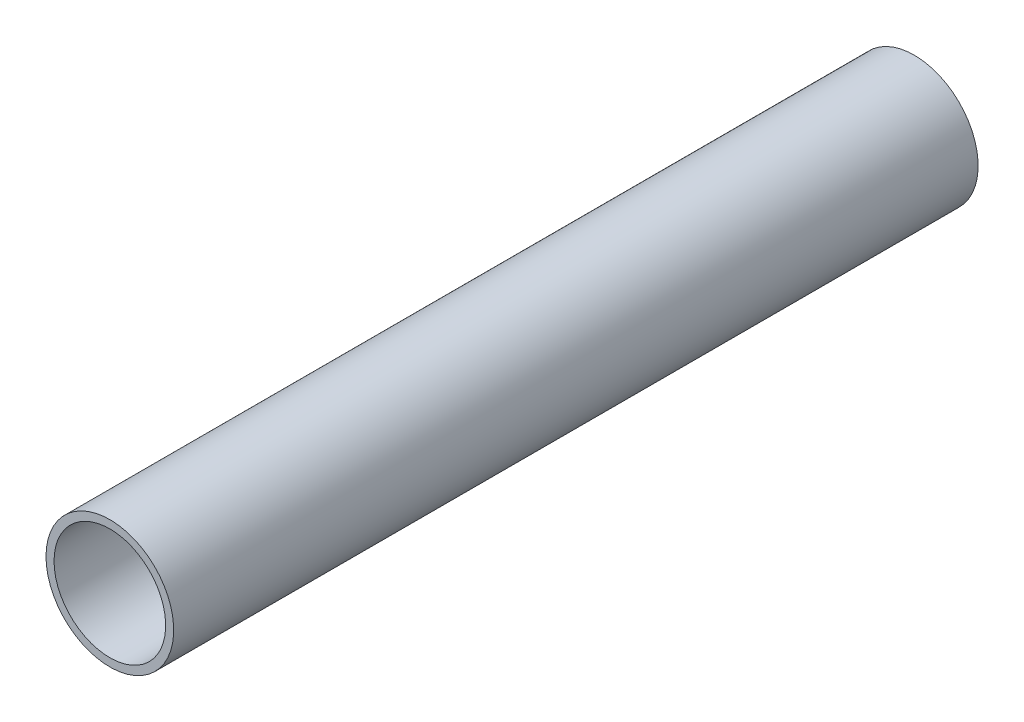
ISO-10303-21;
HEADER;
FILE_DESCRIPTION(('STEP AP214'),'2;1');
FILE_NAME('part.step','',(''),(''),'','','');
FILE_SCHEMA(('AUTOMOTIVE_DESIGN { 1 0 10303 214 1 1 1 1 }'));
ENDSEC;
DATA;
#1=APPLICATION_CONTEXT('core data for automotive mechanical design processes');
#2=APPLICATION_PROTOCOL_DEFINITION('international standard','automotive_design',2000,#1);
#3=PRODUCT_CONTEXT('',#1,'mechanical');
#4=PRODUCT('Part','Part','',(#3));
#5=PRODUCT_RELATED_PRODUCT_CATEGORY('part','',(#4));
#6=PRODUCT_DEFINITION_FORMATION('','',#4);
#7=PRODUCT_DEFINITION_CONTEXT('part definition',#1,'design');
#8=PRODUCT_DEFINITION('design','',#6,#7);
#9=PRODUCT_DEFINITION_SHAPE('','',#8);
#10=(LENGTH_UNIT() NAMED_UNIT(*) SI_UNIT(.MILLI.,.METRE.));
#11=(NAMED_UNIT(*) PLANE_ANGLE_UNIT() SI_UNIT($,.RADIAN.));
#12=(NAMED_UNIT(*) SI_UNIT($,.STERADIAN.) SOLID_ANGLE_UNIT());
#13=UNCERTAINTY_MEASURE_WITH_UNIT(LENGTH_MEASURE(1.E-05),#10,'distance_accuracy_value','');
#14=(GEOMETRIC_REPRESENTATION_CONTEXT(3) GLOBAL_UNCERTAINTY_ASSIGNED_CONTEXT((#13)) GLOBAL_UNIT_ASSIGNED_CONTEXT((#10,
#11,#12)) REPRESENTATION_CONTEXT('',''));
#15=CARTESIAN_POINT('',(0.,0.,0.));
#16=DIRECTION('',(0.,0.,1.));
#17=DIRECTION('',(1.,0.,0.));
#18=AXIS2_PLACEMENT_3D('',#15,#16,#17);
#19=CARTESIAN_POINT('',(0.,0.,50.));
#20=DIRECTION('',(0.,0.,1.));
#21=DIRECTION('',(1.,0.,0.));
#22=AXIS2_PLACEMENT_3D('',#19,#20,#21);
#23=PLANE('',#22);
#24=CARTESIAN_POINT('',(0.,0.,50.));
#25=DIRECTION('',(0.,0.,1.));
#26=DIRECTION('',(1.,0.,0.));
#27=AXIS2_PLACEMENT_3D('',#24,#25,#26);
#28=CIRCLE('',#27,7.9375);
#29=CARTESIAN_POINT('',(-7.9375,0.,50.));
#30=VERTEX_POINT('',#29);
#31=EDGE_CURVE('E10',#30,#30,#28,.T.);
#32=ORIENTED_EDGE('',*,*,#31,.T.);
#33=EDGE_LOOP('',(#32));
#34=FACE_BOUND('',#33,.T.);
#35=CARTESIAN_POINT('',(0.,0.,50.));
#36=DIRECTION('',(0.,0.,1.));
#37=DIRECTION('',(1.,0.,0.));
#38=AXIS2_PLACEMENT_3D('',#35,#36,#37);
#39=CIRCLE('',#38,6.9375);
#40=CARTESIAN_POINT('',(-6.9375,0.,50.));
#41=VERTEX_POINT('',#40);
#42=EDGE_CURVE('E42',#41,#41,#39,.T.);
#43=ORIENTED_EDGE('',*,*,#42,.F.);
#44=EDGE_LOOP('',(#43));
#45=FACE_BOUND('',#44,.T.);
#46=ADVANCED_FACE('F31',(#34,#45),#23,.T.);
#47=CARTESIAN_POINT('',(0.,0.,-50.));
#48=DIRECTION('',(0.,0.,1.));
#49=DIRECTION('',(1.,0.,0.));
#50=AXIS2_PLACEMENT_3D('',#47,#48,#49);
#51=PLANE('',#50);
#52=CARTESIAN_POINT('',(0.,0.,-50.));
#53=DIRECTION('',(0.,0.,1.));
#54=DIRECTION('',(1.,0.,0.));
#55=AXIS2_PLACEMENT_3D('',#52,#53,#54);
#56=CIRCLE('',#55,7.9375);
#57=CARTESIAN_POINT('',(-7.9375,0.,-50.));
#58=VERTEX_POINT('',#57);
#59=EDGE_CURVE('E35',#58,#58,#56,.T.);
#60=ORIENTED_EDGE('',*,*,#59,.F.);
#61=EDGE_LOOP('',(#60));
#62=FACE_BOUND('',#61,.T.);
#63=CARTESIAN_POINT('',(0.,0.,-50.));
#64=DIRECTION('',(0.,0.,1.));
#65=DIRECTION('',(1.,0.,0.));
#66=AXIS2_PLACEMENT_3D('',#63,#64,#65);
#67=CIRCLE('',#66,6.9375);
#68=CARTESIAN_POINT('',(-6.9375,0.,-50.));
#69=VERTEX_POINT('',#68);
#70=EDGE_CURVE('E44',#69,#69,#67,.T.);
#71=ORIENTED_EDGE('',*,*,#70,.T.);
#72=EDGE_LOOP('',(#71));
#73=FACE_BOUND('',#72,.T.);
#74=ADVANCED_FACE('F54',(#62,#73),#51,.F.);
#75=CARTESIAN_POINT('',(0.,0.,50.));
#76=DIRECTION('',(0.,0.,-1.));
#77=DIRECTION('',(-1.,0.,0.));
#78=AXIS2_PLACEMENT_3D('',#75,#76,#77);
#79=CYLINDRICAL_SURFACE('',#78,7.9375);
#80=CARTESIAN_POINT('',(-7.9375,0.,50.));
#81=CARTESIAN_POINT('',(-7.9375,0.,48.9583333333333));
#82=CARTESIAN_POINT('',(-7.9375,0.,47.9166666666667));
#83=CARTESIAN_POINT('',(-7.9375,0.,45.8333333333333));
#84=CARTESIAN_POINT('',(-7.9375,0.,44.7916666666667));
#85=CARTESIAN_POINT('',(-7.9375,0.,42.7083333333333));
#86=CARTESIAN_POINT('',(-7.9375,0.,41.6666666666667));
#87=CARTESIAN_POINT('',(-7.9375,0.,39.5833333333333));
#88=CARTESIAN_POINT('',(-7.9375,0.,38.5416666666667));
#89=CARTESIAN_POINT('',(-7.9375,0.,36.4583333333333));
#90=CARTESIAN_POINT('',(-7.9375,0.,35.4166666666667));
#91=CARTESIAN_POINT('',(-7.9375,0.,33.3333333333333));
#92=CARTESIAN_POINT('',(-7.9375,0.,32.2916666666667));
#93=CARTESIAN_POINT('',(-7.9375,0.,30.2083333333333));
#94=CARTESIAN_POINT('',(-7.9375,0.,29.1666666666667));
#95=CARTESIAN_POINT('',(-7.9375,0.,27.0833333333333));
#96=CARTESIAN_POINT('',(-7.9375,0.,26.0416666666667));
#97=CARTESIAN_POINT('',(-7.9375,0.,23.9583333333333));
#98=CARTESIAN_POINT('',(-7.9375,0.,22.9166666666667));
#99=CARTESIAN_POINT('',(-7.9375,0.,20.8333333333333));
#100=CARTESIAN_POINT('',(-7.9375,0.,19.7916666666667));
#101=CARTESIAN_POINT('',(-7.9375,0.,17.7083333333333));
#102=CARTESIAN_POINT('',(-7.9375,0.,16.6666666666667));
#103=CARTESIAN_POINT('',(-7.9375,0.,14.5833333333333));
#104=CARTESIAN_POINT('',(-7.9375,0.,13.5416666666667));
#105=CARTESIAN_POINT('',(-7.9375,0.,11.4583333333333));
#106=CARTESIAN_POINT('',(-7.9375,0.,10.4166666666667));
#107=CARTESIAN_POINT('',(-7.9375,0.,8.33333333333333));
#108=CARTESIAN_POINT('',(-7.9375,0.,7.29166666666666));
#109=CARTESIAN_POINT('',(-7.9375,0.,5.20833333333333));
#110=CARTESIAN_POINT('',(-7.9375,0.,4.16666666666666));
#111=CARTESIAN_POINT('',(-7.9375,0.,2.08333333333333));
#112=CARTESIAN_POINT('',(-7.9375,0.,1.04166666666666));
#113=CARTESIAN_POINT('',(-7.9375,0.,-1.04166666666667));
#114=CARTESIAN_POINT('',(-7.9375,0.,-2.08333333333334));
#115=CARTESIAN_POINT('',(-7.9375,0.,-4.16666666666667));
#116=CARTESIAN_POINT('',(-7.9375,0.,-5.20833333333334));
#117=CARTESIAN_POINT('',(-7.9375,0.,-7.29166666666667));
#118=CARTESIAN_POINT('',(-7.9375,0.,-8.33333333333334));
#119=CARTESIAN_POINT('',(-7.9375,0.,-10.4166666666667));
#120=CARTESIAN_POINT('',(-7.9375,0.,-11.4583333333333));
#121=CARTESIAN_POINT('',(-7.9375,0.,-13.5416666666667));
#122=CARTESIAN_POINT('',(-7.9375,0.,-14.5833333333333));
#123=CARTESIAN_POINT('',(-7.9375,0.,-16.6666666666667));
#124=CARTESIAN_POINT('',(-7.9375,0.,-17.7083333333333));
#125=CARTESIAN_POINT('',(-7.9375,0.,-19.7916666666667));
#126=CARTESIAN_POINT('',(-7.9375,0.,-20.8333333333333));
#127=CARTESIAN_POINT('',(-7.9375,0.,-22.9166666666667));
#128=CARTESIAN_POINT('',(-7.9375,0.,-23.9583333333333));
#129=CARTESIAN_POINT('',(-7.9375,0.,-26.0416666666667));
#130=CARTESIAN_POINT('',(-7.9375,0.,-27.0833333333333));
#131=CARTESIAN_POINT('',(-7.9375,0.,-29.1666666666667));
#132=CARTESIAN_POINT('',(-7.9375,0.,-30.2083333333333));
#133=CARTESIAN_POINT('',(-7.9375,0.,-32.2916666666667));
#134=CARTESIAN_POINT('',(-7.9375,0.,-33.3333333333333));
#135=CARTESIAN_POINT('',(-7.9375,0.,-35.4166666666667));
#136=CARTESIAN_POINT('',(-7.9375,0.,-36.4583333333333));
#137=CARTESIAN_POINT('',(-7.9375,0.,-38.5416666666667));
#138=CARTESIAN_POINT('',(-7.9375,0.,-39.5833333333333));
#139=CARTESIAN_POINT('',(-7.9375,0.,-41.6666666666667));
#140=CARTESIAN_POINT('',(-7.9375,0.,-42.7083333333333));
#141=CARTESIAN_POINT('',(-7.9375,0.,-44.7916666666667));
#142=CARTESIAN_POINT('',(-7.9375,0.,-45.8333333333333));
#143=CARTESIAN_POINT('',(-7.9375,0.,-47.9166666666667));
#144=CARTESIAN_POINT('',(-7.9375,0.,-48.9583333333333));
#145=CARTESIAN_POINT('',(-7.9375,0.,-50.));
#146=B_SPLINE_CURVE_WITH_KNOTS('',3,(#80,#81,#82,#83,#84,#85,#86,#87,#88,#89,#90,#91,#92,#93,
#94,#95,#96,#97,#98,#99,#100,#101,#102,#103,#104,#105,#106,#107,#108,#109,#110,#111,#112,#113,
#114,#115,#116,#117,#118,#119,#120,#121,#122,#123,#124,#125,#126,#127,#128,#129,#130,#131,#132,
#133,#134,#135,#136,#137,#138,#139,#140,#141,#142,#143,#144,#145),.UNSPECIFIED.,.F.,.F.,(4,2,2,
2,2,2,2,2,2,2,2,2,2,2,2,2,2,2,2,2,2,2,2,2,2,2,2,2,2,2,2,2,4),(0.,3.125,6.25,9.37499999999999,
12.5,15.625,18.75,21.875,25.,28.125,31.25,34.375,37.5,40.625,43.75,46.875,50.,53.125,56.25,
59.375,62.5,65.625,68.75,71.875,75.,78.125,81.25,84.375,87.5,90.625,93.75,96.875,100.),.UNSPECIFIED.);
#147=EDGE_CURVE('BSEAM33',#30,#58,#146,.T.);
#148=ORIENTED_EDGE('',*,*,#31,.F.);
#149=ORIENTED_EDGE('',*,*,#59,.T.);
#150=ORIENTED_EDGE('',*,*,#147,.T.);
#151=ORIENTED_EDGE('',*,*,#147,.F.);
#152=EDGE_LOOP('',(#148,#150,#149,#151));
#153=FACE_BOUND('',#152,.T.);
#154=ADVANCED_FACE('F33',(#153),#79,.T.);
#155=CARTESIAN_POINT('',(0.,0.,50.));
#156=DIRECTION('',(0.,0.,-1.));
#157=DIRECTION('',(-1.,0.,0.));
#158=AXIS2_PLACEMENT_3D('',#155,#156,#157);
#159=CYLINDRICAL_SURFACE('',#158,6.9375);
#160=CARTESIAN_POINT('',(-6.9375,0.,50.));
#161=CARTESIAN_POINT('',(-6.9375,0.,48.9583333333333));
#162=CARTESIAN_POINT('',(-6.9375,0.,47.9166666666667));
#163=CARTESIAN_POINT('',(-6.9375,0.,45.8333333333333));
#164=CARTESIAN_POINT('',(-6.9375,0.,44.7916666666667));
#165=CARTESIAN_POINT('',(-6.9375,0.,42.7083333333333));
#166=CARTESIAN_POINT('',(-6.9375,0.,41.6666666666667));
#167=CARTESIAN_POINT('',(-6.9375,0.,39.5833333333333));
#168=CARTESIAN_POINT('',(-6.9375,0.,38.5416666666667));
#169=CARTESIAN_POINT('',(-6.9375,0.,36.4583333333333));
#170=CARTESIAN_POINT('',(-6.9375,0.,35.4166666666667));
#171=CARTESIAN_POINT('',(-6.9375,0.,33.3333333333333));
#172=CARTESIAN_POINT('',(-6.9375,0.,32.2916666666667));
#173=CARTESIAN_POINT('',(-6.9375,0.,30.2083333333333));
#174=CARTESIAN_POINT('',(-6.9375,0.,29.1666666666667));
#175=CARTESIAN_POINT('',(-6.9375,0.,27.0833333333333));
#176=CARTESIAN_POINT('',(-6.9375,0.,26.0416666666667));
#177=CARTESIAN_POINT('',(-6.9375,0.,23.9583333333333));
#178=CARTESIAN_POINT('',(-6.9375,0.,22.9166666666667));
#179=CARTESIAN_POINT('',(-6.9375,0.,20.8333333333333));
#180=CARTESIAN_POINT('',(-6.9375,0.,19.7916666666667));
#181=CARTESIAN_POINT('',(-6.9375,0.,17.7083333333333));
#182=CARTESIAN_POINT('',(-6.9375,0.,16.6666666666667));
#183=CARTESIAN_POINT('',(-6.9375,0.,14.5833333333333));
#184=CARTESIAN_POINT('',(-6.9375,0.,13.5416666666667));
#185=CARTESIAN_POINT('',(-6.9375,0.,11.4583333333333));
#186=CARTESIAN_POINT('',(-6.9375,0.,10.4166666666667));
#187=CARTESIAN_POINT('',(-6.9375,0.,8.33333333333334));
#188=CARTESIAN_POINT('',(-6.9375,0.,7.29166666666667));
#189=CARTESIAN_POINT('',(-6.9375,0.,5.20833333333333));
#190=CARTESIAN_POINT('',(-6.9375,0.,4.16666666666667));
#191=CARTESIAN_POINT('',(-6.9375,0.,2.08333333333334));
#192=CARTESIAN_POINT('',(-6.9375,0.,1.04166666666667));
#193=CARTESIAN_POINT('',(-6.9375,0.,-1.04166666666667));
#194=CARTESIAN_POINT('',(-6.9375,0.,-2.08333333333334));
#195=CARTESIAN_POINT('',(-6.9375,0.,-4.16666666666667));
#196=CARTESIAN_POINT('',(-6.9375,0.,-5.20833333333333));
#197=CARTESIAN_POINT('',(-6.9375,0.,-7.29166666666667));
#198=CARTESIAN_POINT('',(-6.9375,0.,-8.33333333333334));
#199=CARTESIAN_POINT('',(-6.9375,0.,-10.4166666666667));
#200=CARTESIAN_POINT('',(-6.9375,0.,-11.4583333333333));
#201=CARTESIAN_POINT('',(-6.9375,0.,-13.5416666666667));
#202=CARTESIAN_POINT('',(-6.9375,0.,-14.5833333333333));
#203=CARTESIAN_POINT('',(-6.9375,0.,-16.6666666666667));
#204=CARTESIAN_POINT('',(-6.9375,0.,-17.7083333333333));
#205=CARTESIAN_POINT('',(-6.9375,0.,-19.7916666666667));
#206=CARTESIAN_POINT('',(-6.9375,0.,-20.8333333333333));
#207=CARTESIAN_POINT('',(-6.9375,0.,-22.9166666666667));
#208=CARTESIAN_POINT('',(-6.9375,0.,-23.9583333333333));
#209=CARTESIAN_POINT('',(-6.9375,0.,-26.0416666666667));
#210=CARTESIAN_POINT('',(-6.9375,0.,-27.0833333333333));
#211=CARTESIAN_POINT('',(-6.9375,0.,-29.1666666666667));
#212=CARTESIAN_POINT('',(-6.9375,0.,-30.2083333333333));
#213=CARTESIAN_POINT('',(-6.9375,0.,-32.2916666666667));
#214=CARTESIAN_POINT('',(-6.9375,0.,-33.3333333333333));
#215=CARTESIAN_POINT('',(-6.9375,0.,-35.4166666666667));
#216=CARTESIAN_POINT('',(-6.9375,0.,-36.4583333333333));
#217=CARTESIAN_POINT('',(-6.9375,0.,-38.5416666666667));
#218=CARTESIAN_POINT('',(-6.9375,0.,-39.5833333333333));
#219=CARTESIAN_POINT('',(-6.9375,0.,-41.6666666666667));
#220=CARTESIAN_POINT('',(-6.9375,0.,-42.7083333333333));
#221=CARTESIAN_POINT('',(-6.9375,0.,-44.7916666666667));
#222=CARTESIAN_POINT('',(-6.9375,0.,-45.8333333333333));
#223=CARTESIAN_POINT('',(-6.9375,0.,-47.9166666666667));
#224=CARTESIAN_POINT('',(-6.9375,0.,-48.9583333333333));
#225=CARTESIAN_POINT('',(-6.9375,0.,-50.));
#226=B_SPLINE_CURVE_WITH_KNOTS('',3,(#160,#161,#162,#163,#164,#165,#166,#167,#168,#169,#170,
#171,#172,#173,#174,#175,#176,#177,#178,#179,#180,#181,#182,#183,#184,#185,#186,#187,#188,#189,
#190,#191,#192,#193,#194,#195,#196,#197,#198,#199,#200,#201,#202,#203,#204,#205,#206,#207,#208,
#209,#210,#211,#212,#213,#214,#215,#216,#217,#218,#219,#220,#221,#222,#223,#224,#225),
.UNSPECIFIED.,.F.,.F.,(4,2,2,2,2,2,2,2,2,2,2,2,2,2,2,2,2,2,2,2,2,2,2,2,2,2,2,2,2,2,2,2,4),(0.,
3.125,6.25000000000001,9.375,12.5,15.625,18.75,21.875,25.,28.125,31.25,34.375,37.5,40.625,43.75,
46.875,50.,53.125,56.25,59.375,62.5,65.625,68.75,71.875,75.,78.125,81.25,84.375,87.5,90.625,
93.75,96.875,100.),.UNSPECIFIED.);
#227=EDGE_CURVE('BSEAM50',#41,#69,#226,.T.);
#228=ORIENTED_EDGE('',*,*,#42,.T.);
#229=ORIENTED_EDGE('',*,*,#70,.F.);
#230=ORIENTED_EDGE('',*,*,#227,.T.);
#231=ORIENTED_EDGE('',*,*,#227,.F.);
#232=EDGE_LOOP('',(#228,#230,#229,#231));
#233=FACE_BOUND('',#232,.T.);
#234=ADVANCED_FACE('F50',(#233),#159,.F.);
#235=CLOSED_SHELL('',(#46,#74,#154,#234));
#236=MANIFOLD_SOLID_BREP('B2',#235);
#237=ADVANCED_BREP_SHAPE_REPRESENTATION('',(#18,#236),#14);
#238=SHAPE_DEFINITION_REPRESENTATION(#9,#237);
ENDSEC;
END-ISO-10303-21;
